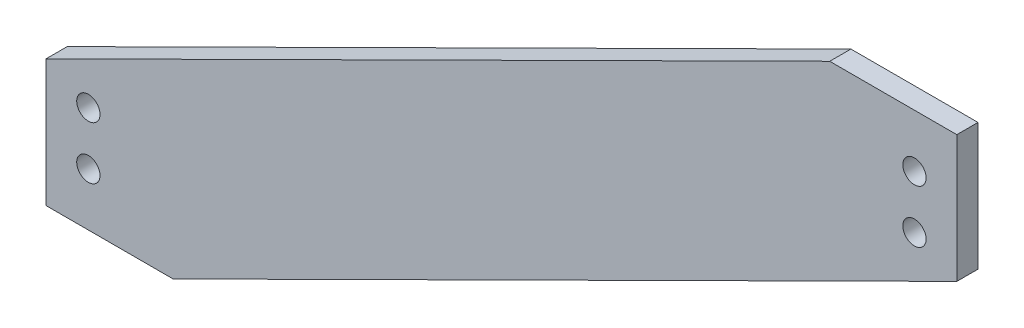
ISO-10303-21;
HEADER;
FILE_DESCRIPTION(('STEP AP214'),'2;1');
FILE_NAME('part.step','',(''),(''),'','','');
FILE_SCHEMA(('AUTOMOTIVE_DESIGN { 1 0 10303 214 1 1 1 1 }'));
ENDSEC;
DATA;
#1=APPLICATION_CONTEXT('core data for automotive mechanical design processes');
#2=APPLICATION_PROTOCOL_DEFINITION('international standard','automotive_design',2000,#1);
#3=PRODUCT_CONTEXT('',#1,'mechanical');
#4=PRODUCT('Part','Part','',(#3));
#5=PRODUCT_RELATED_PRODUCT_CATEGORY('part','',(#4));
#6=PRODUCT_DEFINITION_FORMATION('','',#4);
#7=PRODUCT_DEFINITION_CONTEXT('part definition',#1,'design');
#8=PRODUCT_DEFINITION('design','',#6,#7);
#9=PRODUCT_DEFINITION_SHAPE('','',#8);
#10=(LENGTH_UNIT() NAMED_UNIT(*) SI_UNIT(.MILLI.,.METRE.));
#11=(NAMED_UNIT(*) PLANE_ANGLE_UNIT() SI_UNIT($,.RADIAN.));
#12=(NAMED_UNIT(*) SI_UNIT($,.STERADIAN.) SOLID_ANGLE_UNIT());
#13=UNCERTAINTY_MEASURE_WITH_UNIT(LENGTH_MEASURE(1.E-05),#10,'distance_accuracy_value','');
#14=(GEOMETRIC_REPRESENTATION_CONTEXT(3) GLOBAL_UNCERTAINTY_ASSIGNED_CONTEXT((#13)) GLOBAL_UNIT_ASSIGNED_CONTEXT((#10,
#11,#12)) REPRESENTATION_CONTEXT('',''));
#15=CARTESIAN_POINT('',(0.,0.,0.));
#16=DIRECTION('',(0.,0.,1.));
#17=DIRECTION('',(1.,0.,0.));
#18=AXIS2_PLACEMENT_3D('',#15,#16,#17);
#19=CARTESIAN_POINT('',(0.,0.,-247.202346267182));
#20=DIRECTION('',(-1.,0.,0.));
#21=DIRECTION('',(0.,0.,1.));
#22=AXIS2_PLACEMENT_3D('',#19,#20,#21);
#23=PLANE('',#22);
#24=DIRECTION('',(0.,1.,0.));
#25=VECTOR('',#24,1.);
#26=CARTESIAN_POINT('',(0.,0.,0.));
#27=LINE('',#26,#25);
#28=CARTESIAN_POINT('',(0.,0.,0.));
#29=VERTEX_POINT('',#28);
#30=CARTESIAN_POINT('',(0.,30.,0.));
#31=VERTEX_POINT('',#30);
#32=EDGE_CURVE('E62',#29,#31,#27,.T.);
#33=ORIENTED_EDGE('',*,*,#32,.F.);
#34=DIRECTION('',(0.,0.,-1.));
#35=VECTOR('',#34,1.);
#36=CARTESIAN_POINT('',(0.,0.,5.));
#37=LINE('',#36,#35);
#38=CARTESIAN_POINT('',(0.,0.,5.));
#39=VERTEX_POINT('',#38);
#40=EDGE_CURVE('E11',#39,#29,#37,.T.);
#41=ORIENTED_EDGE('',*,*,#40,.F.);
#42=DIRECTION('',(0.,-1.,0.));
#43=VECTOR('',#42,1.);
#44=CARTESIAN_POINT('',(0.,0.,5.));
#45=LINE('',#44,#43);
#46=CARTESIAN_POINT('',(0.,30.,5.));
#47=VERTEX_POINT('',#46);
#48=EDGE_CURVE('E101',#47,#39,#45,.T.);
#49=ORIENTED_EDGE('',*,*,#48,.F.);
#50=DIRECTION('',(0.,0.,1.));
#51=VECTOR('',#50,1.);
#52=CARTESIAN_POINT('',(0.,30.,-247.202346267182));
#53=LINE('',#52,#51);
#54=EDGE_CURVE('E136',#31,#47,#53,.T.);
#55=ORIENTED_EDGE('',*,*,#54,.F.);
#56=EDGE_LOOP('',(#33,#41,#49,#55));
#57=FACE_BOUND('',#56,.T.);
#58=ADVANCED_FACE('F38',(#57),#23,.T.);
#59=CARTESIAN_POINT('',(0.,30.,-247.202346267182));
#60=DIRECTION('',(-0.445276562834422,0.895393088308349,0.));
#61=DIRECTION('',(-0.895393088308349,-0.445276562834422,0.));
#62=AXIS2_PLACEMENT_3D('',#59,#60,#61);
#63=PLANE('',#62);
#64=DIRECTION('',(0.895393088308349,0.445276562834422,0.));
#65=VECTOR('',#64,1.);
#66=CARTESIAN_POINT('',(0.,30.,0.));
#67=LINE('',#66,#65);
#68=CARTESIAN_POINT('',(185.,122.,0.));
#69=VERTEX_POINT('',#68);
#70=EDGE_CURVE('E162',#31,#69,#67,.T.);
#71=ORIENTED_EDGE('',*,*,#70,.F.);
#72=ORIENTED_EDGE('',*,*,#54,.T.);
#73=DIRECTION('',(-0.895393088308349,-0.445276562834422,0.));
#74=VECTOR('',#73,1.);
#75=CARTESIAN_POINT('',(0.,30.,5.));
#76=LINE('',#75,#74);
#77=CARTESIAN_POINT('',(185.,122.,5.));
#78=VERTEX_POINT('',#77);
#79=EDGE_CURVE('E124',#78,#47,#76,.T.);
#80=ORIENTED_EDGE('',*,*,#79,.F.);
#81=DIRECTION('',(0.,0.,1.));
#82=VECTOR('',#81,1.);
#83=CARTESIAN_POINT('',(185.,122.,-247.202346267182));
#84=LINE('',#83,#82);
#85=EDGE_CURVE('E139',#69,#78,#84,.T.);
#86=ORIENTED_EDGE('',*,*,#85,.F.);
#87=EDGE_LOOP('',(#71,#72,#80,#86));
#88=FACE_BOUND('',#87,.T.);
#89=ADVANCED_FACE('F167',(#88),#63,.T.);
#90=CARTESIAN_POINT('',(0.,0.,5.));
#91=DIRECTION('',(0.,1.,0.));
#92=DIRECTION('',(0.,0.,1.));
#93=AXIS2_PLACEMENT_3D('',#90,#91,#92);
#94=PLANE('',#93);
#95=DIRECTION('',(1.,0.,0.));
#96=VECTOR('',#95,1.);
#97=CARTESIAN_POINT('',(0.,0.,0.));
#98=LINE('',#97,#96);
#99=CARTESIAN_POINT('',(30.0000000000001,0.,0.));
#100=VERTEX_POINT('',#99);
#101=EDGE_CURVE('E109',#29,#100,#98,.T.);
#102=ORIENTED_EDGE('',*,*,#101,.T.);
#103=DIRECTION('',(0.,0.,1.));
#104=VECTOR('',#103,1.);
#105=CARTESIAN_POINT('',(30.0000000000001,0.,-247.202346267182));
#106=LINE('',#105,#104);
#107=CARTESIAN_POINT('',(30.0000000000001,0.,5.));
#108=VERTEX_POINT('',#107);
#109=EDGE_CURVE('E108',#100,#108,#106,.T.);
#110=ORIENTED_EDGE('',*,*,#109,.T.);
#111=DIRECTION('',(1.,0.,0.));
#112=VECTOR('',#111,1.);
#113=CARTESIAN_POINT('',(0.,0.,5.));
#114=LINE('',#113,#112);
#115=EDGE_CURVE('E93',#39,#108,#114,.T.);
#116=ORIENTED_EDGE('',*,*,#115,.F.);
#117=ORIENTED_EDGE('',*,*,#40,.T.);
#118=EDGE_LOOP('',(#102,#110,#116,#117));
#119=FACE_BOUND('',#118,.T.);
#120=ADVANCED_FACE('F40',(#119),#94,.F.);
#121=CARTESIAN_POINT('',(215.,122.,5.));
#122=DIRECTION('',(0.,-1.,0.));
#123=DIRECTION('',(0.,0.,-1.));
#124=AXIS2_PLACEMENT_3D('',#121,#122,#123);
#125=PLANE('',#124);
#126=DIRECTION('',(-1.,0.,0.));
#127=VECTOR('',#126,1.);
#128=CARTESIAN_POINT('',(215.,122.,0.));
#129=LINE('',#128,#127);
#130=CARTESIAN_POINT('',(215.,122.,0.));
#131=VERTEX_POINT('',#130);
#132=EDGE_CURVE('E105',#131,#69,#129,.T.);
#133=ORIENTED_EDGE('',*,*,#132,.T.);
#134=ORIENTED_EDGE('',*,*,#85,.T.);
#135=DIRECTION('',(-1.,0.,0.));
#136=VECTOR('',#135,1.);
#137=CARTESIAN_POINT('',(215.,122.,5.));
#138=LINE('',#137,#136);
#139=CARTESIAN_POINT('',(215.,122.,5.));
#140=VERTEX_POINT('',#139);
#141=EDGE_CURVE('E104',#140,#78,#138,.T.);
#142=ORIENTED_EDGE('',*,*,#141,.F.);
#143=DIRECTION('',(0.,0.,-1.));
#144=VECTOR('',#143,1.);
#145=CARTESIAN_POINT('',(215.,122.,5.));
#146=LINE('',#145,#144);
#147=EDGE_CURVE('E47',#140,#131,#146,.T.);
#148=ORIENTED_EDGE('',*,*,#147,.T.);
#149=EDGE_LOOP('',(#133,#134,#142,#148));
#150=FACE_BOUND('',#149,.T.);
#151=ADVANCED_FACE('F157',(#150),#125,.F.);
#152=CARTESIAN_POINT('',(0.,0.,5.));
#153=DIRECTION('',(0.,0.,1.));
#154=DIRECTION('',(1.,0.,0.));
#155=AXIS2_PLACEMENT_3D('',#152,#153,#154);
#156=PLANE('',#155);
#157=CARTESIAN_POINT('',(205.,97.,5.));
#158=DIRECTION('',(0.,0.,1.));
#159=DIRECTION('',(1.,0.,0.));
#160=AXIS2_PLACEMENT_3D('',#157,#158,#159);
#161=CIRCLE('',#160,2.75);
#162=CARTESIAN_POINT('',(207.75,97.,5.));
#163=VERTEX_POINT('',#162);
#164=EDGE_CURVE('E294',#163,#163,#161,.T.);
#165=ORIENTED_EDGE('',*,*,#164,.F.);
#166=EDGE_LOOP('',(#165));
#167=FACE_BOUND('',#166,.T.);
#168=CARTESIAN_POINT('',(10.,25.,5.));
#169=DIRECTION('',(0.,0.,1.));
#170=DIRECTION('',(1.,0.,0.));
#171=AXIS2_PLACEMENT_3D('',#168,#169,#170);
#172=CIRCLE('',#171,2.74999999999999);
#173=CARTESIAN_POINT('',(12.75,25.,5.));
#174=VERTEX_POINT('',#173);
#175=EDGE_CURVE('E298',#174,#174,#172,.T.);
#176=ORIENTED_EDGE('',*,*,#175,.F.);
#177=EDGE_LOOP('',(#176));
#178=FACE_BOUND('',#177,.T.);
#179=CARTESIAN_POINT('',(10.,12.5,5.));
#180=DIRECTION('',(0.,0.,1.));
#181=DIRECTION('',(1.,0.,0.));
#182=AXIS2_PLACEMENT_3D('',#179,#180,#181);
#183=CIRCLE('',#182,2.74999999999999);
#184=CARTESIAN_POINT('',(12.75,12.5,5.));
#185=VERTEX_POINT('',#184);
#186=EDGE_CURVE('E308',#185,#185,#183,.T.);
#187=ORIENTED_EDGE('',*,*,#186,.F.);
#188=EDGE_LOOP('',(#187));
#189=FACE_BOUND('',#188,.T.);
#190=CARTESIAN_POINT('',(205.,109.5,5.));
#191=DIRECTION('',(0.,0.,1.));
#192=DIRECTION('',(1.,0.,0.));
#193=AXIS2_PLACEMENT_3D('',#190,#191,#192);
#194=CIRCLE('',#193,2.75);
#195=CARTESIAN_POINT('',(207.75,109.5,5.));
#196=VERTEX_POINT('',#195);
#197=EDGE_CURVE('E127',#196,#196,#194,.T.);
#198=ORIENTED_EDGE('',*,*,#197,.F.);
#199=EDGE_LOOP('',(#198));
#200=FACE_BOUND('',#199,.T.);
#201=ORIENTED_EDGE('',*,*,#141,.T.);
#202=ORIENTED_EDGE('',*,*,#79,.T.);
#203=ORIENTED_EDGE('',*,*,#48,.T.);
#204=ORIENTED_EDGE('',*,*,#115,.T.);
#205=DIRECTION('',(0.895393088308349,0.445276562834422,0.));
#206=VECTOR('',#205,1.);
#207=CARTESIAN_POINT('',(215.,92.,5.));
#208=LINE('',#207,#206);
#209=CARTESIAN_POINT('',(215.,92.,5.));
#210=VERTEX_POINT('',#209);
#211=EDGE_CURVE('E98',#108,#210,#208,.T.);
#212=ORIENTED_EDGE('',*,*,#211,.T.);
#213=DIRECTION('',(0.,1.,0.));
#214=VECTOR('',#213,1.);
#215=CARTESIAN_POINT('',(215.,122.,5.));
#216=LINE('',#215,#214);
#217=EDGE_CURVE('E119',#210,#140,#216,.T.);
#218=ORIENTED_EDGE('',*,*,#217,.T.);
#219=EDGE_LOOP('',(#201,#202,#203,#204,#212,#218));
#220=FACE_BOUND('',#219,.T.);
#221=ADVANCED_FACE('F95',(#167,#178,#189,#200,#220),#156,.T.);
#222=CARTESIAN_POINT('',(0.,0.,0.));
#223=DIRECTION('',(0.,0.,1.));
#224=DIRECTION('',(1.,0.,0.));
#225=AXIS2_PLACEMENT_3D('',#222,#223,#224);
#226=PLANE('',#225);
#227=CARTESIAN_POINT('',(205.,97.,0.));
#228=DIRECTION('',(0.,0.,1.));
#229=DIRECTION('',(1.,0.,0.));
#230=AXIS2_PLACEMENT_3D('',#227,#228,#229);
#231=CIRCLE('',#230,2.75);
#232=CARTESIAN_POINT('',(207.75,97.,0.));
#233=VERTEX_POINT('',#232);
#234=EDGE_CURVE('E291',#233,#233,#231,.T.);
#235=ORIENTED_EDGE('',*,*,#234,.T.);
#236=EDGE_LOOP('',(#235));
#237=FACE_BOUND('',#236,.T.);
#238=CARTESIAN_POINT('',(10.,25.,0.));
#239=DIRECTION('',(0.,0.,1.));
#240=DIRECTION('',(1.,0.,0.));
#241=AXIS2_PLACEMENT_3D('',#238,#239,#240);
#242=CIRCLE('',#241,2.75);
#243=CARTESIAN_POINT('',(12.75,25.,0.));
#244=VERTEX_POINT('',#243);
#245=EDGE_CURVE('E304',#244,#244,#242,.T.);
#246=ORIENTED_EDGE('',*,*,#245,.T.);
#247=EDGE_LOOP('',(#246));
#248=FACE_BOUND('',#247,.T.);
#249=CARTESIAN_POINT('',(10.,12.5,0.));
#250=DIRECTION('',(0.,0.,1.));
#251=DIRECTION('',(1.,0.,0.));
#252=AXIS2_PLACEMENT_3D('',#249,#250,#251);
#253=CIRCLE('',#252,2.75);
#254=CARTESIAN_POINT('',(12.75,12.5,0.));
#255=VERTEX_POINT('',#254);
#256=EDGE_CURVE('E312',#255,#255,#253,.T.);
#257=ORIENTED_EDGE('',*,*,#256,.T.);
#258=EDGE_LOOP('',(#257));
#259=FACE_BOUND('',#258,.T.);
#260=CARTESIAN_POINT('',(205.,109.5,0.));
#261=DIRECTION('',(0.,0.,1.));
#262=DIRECTION('',(1.,0.,0.));
#263=AXIS2_PLACEMENT_3D('',#260,#261,#262);
#264=CIRCLE('',#263,2.75);
#265=CARTESIAN_POINT('',(207.75,109.5,0.));
#266=VERTEX_POINT('',#265);
#267=EDGE_CURVE('E120',#266,#266,#264,.T.);
#268=ORIENTED_EDGE('',*,*,#267,.T.);
#269=EDGE_LOOP('',(#268));
#270=FACE_BOUND('',#269,.T.);
#271=ORIENTED_EDGE('',*,*,#101,.F.);
#272=ORIENTED_EDGE('',*,*,#32,.T.);
#273=ORIENTED_EDGE('',*,*,#70,.T.);
#274=ORIENTED_EDGE('',*,*,#132,.F.);
#275=DIRECTION('',(0.,-1.,0.));
#276=VECTOR('',#275,1.);
#277=CARTESIAN_POINT('',(215.,122.,0.));
#278=LINE('',#277,#276);
#279=CARTESIAN_POINT('',(215.,92.,0.));
#280=VERTEX_POINT('',#279);
#281=EDGE_CURVE('E54',#131,#280,#278,.T.);
#282=ORIENTED_EDGE('',*,*,#281,.T.);
#283=DIRECTION('',(-0.895393088308349,-0.445276562834422,0.));
#284=VECTOR('',#283,1.);
#285=CARTESIAN_POINT('',(215.,92.,0.));
#286=LINE('',#285,#284);
#287=EDGE_CURVE('E145',#280,#100,#286,.T.);
#288=ORIENTED_EDGE('',*,*,#287,.T.);
#289=EDGE_LOOP('',(#271,#272,#273,#274,#282,#288));
#290=FACE_BOUND('',#289,.T.);
#291=ADVANCED_FACE('F160',(#237,#248,#259,#270,#290),#226,.F.);
#292=CARTESIAN_POINT('',(215.,92.,-247.202346267182));
#293=DIRECTION('',(0.445276562834422,-0.895393088308349,0.));
#294=DIRECTION('',(0.895393088308349,0.445276562834422,0.));
#295=AXIS2_PLACEMENT_3D('',#292,#293,#294);
#296=PLANE('',#295);
#297=ORIENTED_EDGE('',*,*,#287,.F.);
#298=DIRECTION('',(0.,0.,1.));
#299=VECTOR('',#298,1.);
#300=CARTESIAN_POINT('',(215.,92.,-247.202346267182));
#301=LINE('',#300,#299);
#302=EDGE_CURVE('E114',#280,#210,#301,.T.);
#303=ORIENTED_EDGE('',*,*,#302,.T.);
#304=ORIENTED_EDGE('',*,*,#211,.F.);
#305=ORIENTED_EDGE('',*,*,#109,.F.);
#306=EDGE_LOOP('',(#297,#303,#304,#305));
#307=FACE_BOUND('',#306,.T.);
#308=ADVANCED_FACE('F116',(#307),#296,.T.);
#309=CARTESIAN_POINT('',(215.,122.,-247.202346267182));
#310=DIRECTION('',(1.,0.,0.));
#311=DIRECTION('',(0.,0.,-1.));
#312=AXIS2_PLACEMENT_3D('',#309,#310,#311);
#313=PLANE('',#312);
#314=ORIENTED_EDGE('',*,*,#281,.F.);
#315=ORIENTED_EDGE('',*,*,#147,.F.);
#316=ORIENTED_EDGE('',*,*,#217,.F.);
#317=ORIENTED_EDGE('',*,*,#302,.F.);
#318=EDGE_LOOP('',(#314,#315,#316,#317));
#319=FACE_BOUND('',#318,.T.);
#320=ADVANCED_FACE('F178',(#319),#313,.T.);
#321=CARTESIAN_POINT('',(205.,109.5,5.));
#322=DIRECTION('',(0.,0.,1.));
#323=DIRECTION('',(1.,0.,0.));
#324=AXIS2_PLACEMENT_3D('',#321,#322,#323);
#325=CYLINDRICAL_SURFACE('',#324,2.75);
#326=ORIENTED_EDGE('',*,*,#267,.F.);
#327=EDGE_LOOP('',(#326));
#328=FACE_BOUND('',#327,.T.);
#329=ORIENTED_EDGE('',*,*,#197,.T.);
#330=EDGE_LOOP('',(#329));
#331=FACE_BOUND('',#330,.T.);
#332=ADVANCED_FACE('F175',(#328,#331),#325,.F.);
#333=CARTESIAN_POINT('',(10.,12.5,5.));
#334=DIRECTION('',(0.,0.,1.));
#335=DIRECTION('',(1.,0.,0.));
#336=AXIS2_PLACEMENT_3D('',#333,#334,#335);
#337=CYLINDRICAL_SURFACE('',#336,2.74999999999999);
#338=ORIENTED_EDGE('',*,*,#256,.F.);
#339=EDGE_LOOP('',(#338));
#340=FACE_BOUND('',#339,.T.);
#341=ORIENTED_EDGE('',*,*,#186,.T.);
#342=EDGE_LOOP('',(#341));
#343=FACE_BOUND('',#342,.T.);
#344=ADVANCED_FACE('F256',(#340,#343),#337,.F.);
#345=CARTESIAN_POINT('',(10.,25.,5.));
#346=DIRECTION('',(0.,0.,1.));
#347=DIRECTION('',(1.,0.,0.));
#348=AXIS2_PLACEMENT_3D('',#345,#346,#347);
#349=CYLINDRICAL_SURFACE('',#348,2.74999999999999);
#350=ORIENTED_EDGE('',*,*,#245,.F.);
#351=EDGE_LOOP('',(#350));
#352=FACE_BOUND('',#351,.T.);
#353=ORIENTED_EDGE('',*,*,#175,.T.);
#354=EDGE_LOOP('',(#353));
#355=FACE_BOUND('',#354,.T.);
#356=ADVANCED_FACE('F265',(#352,#355),#349,.F.);
#357=CARTESIAN_POINT('',(205.,97.,5.));
#358=DIRECTION('',(0.,0.,1.));
#359=DIRECTION('',(1.,0.,0.));
#360=AXIS2_PLACEMENT_3D('',#357,#358,#359);
#361=CYLINDRICAL_SURFACE('',#360,2.75);
#362=ORIENTED_EDGE('',*,*,#234,.F.);
#363=EDGE_LOOP('',(#362));
#364=FACE_BOUND('',#363,.T.);
#365=ORIENTED_EDGE('',*,*,#164,.T.);
#366=EDGE_LOOP('',(#365));
#367=FACE_BOUND('',#366,.T.);
#368=ADVANCED_FACE('F274',(#364,#367),#361,.F.);
#369=CLOSED_SHELL('',(#58,#89,#120,#151,#221,#291,#308,#320,#332,#344,#356,#368));
#370=MANIFOLD_SOLID_BREP('B2',#369);
#371=ADVANCED_BREP_SHAPE_REPRESENTATION('',(#18,#370),#14);
#372=SHAPE_DEFINITION_REPRESENTATION(#9,#371);
ENDSEC;
END-ISO-10303-21;
